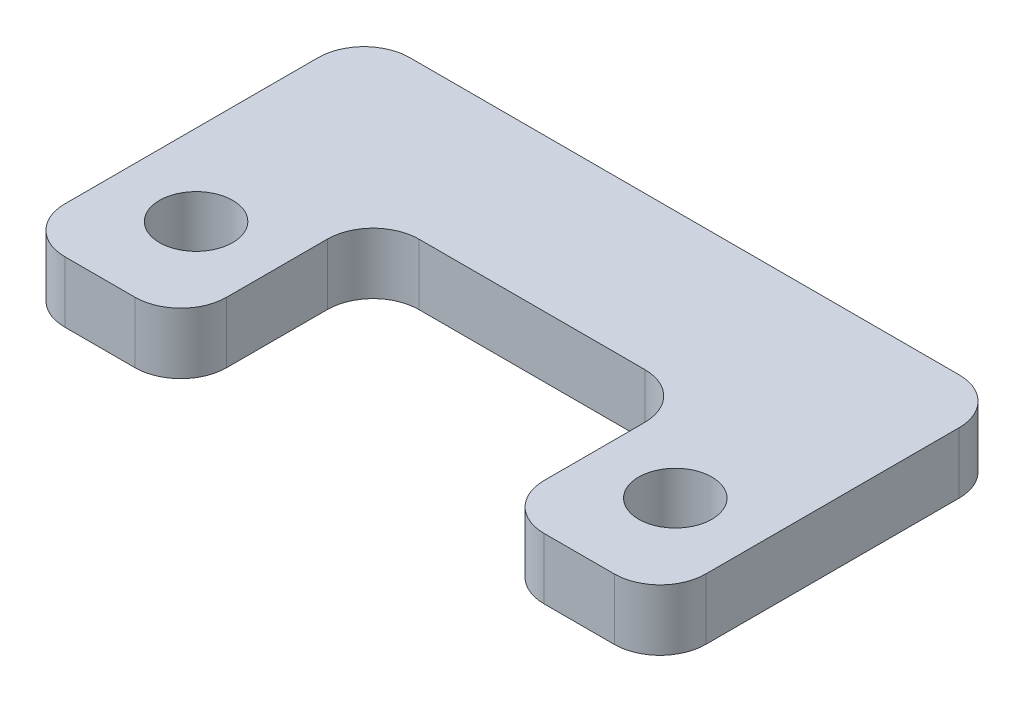
ISO-10303-21;
HEADER;
FILE_DESCRIPTION(('STEP AP214'),'2;1');
FILE_NAME('part.step','',(''),(''),'','','');
FILE_SCHEMA(('AUTOMOTIVE_DESIGN { 1 0 10303 214 1 1 1 1 }'));
ENDSEC;
DATA;
#1=APPLICATION_CONTEXT('core data for automotive mechanical design processes');
#2=APPLICATION_PROTOCOL_DEFINITION('international standard','automotive_design',2000,#1);
#3=PRODUCT_CONTEXT('',#1,'mechanical');
#4=PRODUCT('Part','Part','',(#3));
#5=PRODUCT_RELATED_PRODUCT_CATEGORY('part','',(#4));
#6=PRODUCT_DEFINITION_FORMATION('','',#4);
#7=PRODUCT_DEFINITION_CONTEXT('part definition',#1,'design');
#8=PRODUCT_DEFINITION('design','',#6,#7);
#9=PRODUCT_DEFINITION_SHAPE('','',#8);
#10=(LENGTH_UNIT() NAMED_UNIT(*) SI_UNIT(.MILLI.,.METRE.));
#11=(NAMED_UNIT(*) PLANE_ANGLE_UNIT() SI_UNIT($,.RADIAN.));
#12=(NAMED_UNIT(*) SI_UNIT($,.STERADIAN.) SOLID_ANGLE_UNIT());
#13=UNCERTAINTY_MEASURE_WITH_UNIT(LENGTH_MEASURE(1.E-05),#10,'distance_accuracy_value','');
#14=(GEOMETRIC_REPRESENTATION_CONTEXT(3) GLOBAL_UNCERTAINTY_ASSIGNED_CONTEXT((#13)) GLOBAL_UNIT_ASSIGNED_CONTEXT((#10,
#11,#12)) REPRESENTATION_CONTEXT('',''));
#15=CARTESIAN_POINT('',(0.,0.,0.));
#16=DIRECTION('',(0.,0.,1.));
#17=DIRECTION('',(1.,0.,0.));
#18=AXIS2_PLACEMENT_3D('',#15,#16,#17);
#19=CARTESIAN_POINT('',(10.5,2.,-2.5));
#20=DIRECTION('',(-1.,0.,0.));
#21=DIRECTION('',(0.,0.,1.));
#22=AXIS2_PLACEMENT_3D('',#19,#20,#21);
#23=PLANE('',#22);
#24=DIRECTION('',(0.,0.,-1.));
#25=VECTOR('',#24,1.);
#26=CARTESIAN_POINT('',(10.5,0.,-2.5));
#27=LINE('',#26,#25);
#28=CARTESIAN_POINT('',(10.5,0.,7.3));
#29=VERTEX_POINT('',#28);
#30=CARTESIAN_POINT('',(10.5,0.,-1.));
#31=VERTEX_POINT('',#30);
#32=EDGE_CURVE('E190',#29,#31,#27,.T.);
#33=ORIENTED_EDGE('',*,*,#32,.T.);
#34=DIRECTION('',(0.,-1.,0.));
#35=VECTOR('',#34,1.);
#36=CARTESIAN_POINT('',(10.5,2.,-1.));
#37=LINE('',#36,#35);
#38=CARTESIAN_POINT('',(10.5,2.,-1.));
#39=VERTEX_POINT('',#38);
#40=EDGE_CURVE('E165',#31,#39,#37,.F.);
#41=ORIENTED_EDGE('',*,*,#40,.T.);
#42=DIRECTION('',(0.,0.,-1.));
#43=VECTOR('',#42,1.);
#44=CARTESIAN_POINT('',(10.5,2.,2.5));
#45=LINE('',#44,#43);
#46=CARTESIAN_POINT('',(10.5,2.,7.3));
#47=VERTEX_POINT('',#46);
#48=EDGE_CURVE('E219',#47,#39,#45,.T.);
#49=ORIENTED_EDGE('',*,*,#48,.F.);
#50=DIRECTION('',(0.,-1.,0.));
#51=VECTOR('',#50,1.);
#52=CARTESIAN_POINT('',(10.5,2.,7.3));
#53=LINE('',#52,#51);
#54=EDGE_CURVE('E171',#47,#29,#53,.T.);
#55=ORIENTED_EDGE('',*,*,#54,.T.);
#56=EDGE_LOOP('',(#33,#41,#49,#55));
#57=FACE_BOUND('',#56,.T.);
#58=ADVANCED_FACE('F45',(#57),#23,.F.);
#59=CARTESIAN_POINT('',(-10.5,2.,-2.5));
#60=DIRECTION('',(0.,0.,1.));
#61=DIRECTION('',(1.,0.,0.));
#62=AXIS2_PLACEMENT_3D('',#59,#60,#61);
#63=PLANE('',#62);
#64=DIRECTION('',(-1.,0.,0.));
#65=VECTOR('',#64,1.);
#66=CARTESIAN_POINT('',(-10.5,2.,-2.5));
#67=LINE('',#66,#65);
#68=CARTESIAN_POINT('',(8.99999999999999,2.,-2.5));
#69=VERTEX_POINT('',#68);
#70=CARTESIAN_POINT('',(-9.00000000000001,2.,-2.5));
#71=VERTEX_POINT('',#70);
#72=EDGE_CURVE('E181',#69,#71,#67,.T.);
#73=ORIENTED_EDGE('',*,*,#72,.F.);
#74=DIRECTION('',(0.,-1.,0.));
#75=VECTOR('',#74,1.);
#76=CARTESIAN_POINT('',(8.99999999999999,2.,-2.5));
#77=LINE('',#76,#75);
#78=CARTESIAN_POINT('',(8.99999999999999,0.,-2.5));
#79=VERTEX_POINT('',#78);
#80=EDGE_CURVE('E164',#69,#79,#77,.T.);
#81=ORIENTED_EDGE('',*,*,#80,.T.);
#82=DIRECTION('',(-1.,0.,0.));
#83=VECTOR('',#82,1.);
#84=CARTESIAN_POINT('',(-10.5,0.,-2.5));
#85=LINE('',#84,#83);
#86=CARTESIAN_POINT('',(-9.00000000000001,0.,-2.5));
#87=VERTEX_POINT('',#86);
#88=EDGE_CURVE('E178',#79,#87,#85,.T.);
#89=ORIENTED_EDGE('',*,*,#88,.T.);
#90=DIRECTION('',(0.,-1.,0.));
#91=VECTOR('',#90,1.);
#92=CARTESIAN_POINT('',(-9.00000000000001,2.,-2.5));
#93=LINE('',#92,#91);
#94=EDGE_CURVE('E184',#87,#71,#93,.F.);
#95=ORIENTED_EDGE('',*,*,#94,.T.);
#96=EDGE_LOOP('',(#73,#81,#89,#95));
#97=FACE_BOUND('',#96,.T.);
#98=ADVANCED_FACE('F177',(#97),#63,.F.);
#99=CARTESIAN_POINT('',(-10.5,2.,2.5));
#100=DIRECTION('',(1.,0.,0.));
#101=DIRECTION('',(0.,0.,-1.));
#102=AXIS2_PLACEMENT_3D('',#99,#100,#101);
#103=PLANE('',#102);
#104=DIRECTION('',(0.,0.,1.));
#105=VECTOR('',#104,1.);
#106=CARTESIAN_POINT('',(-10.5,0.,2.5));
#107=LINE('',#106,#105);
#108=CARTESIAN_POINT('',(-10.5,0.,-1.));
#109=VERTEX_POINT('',#108);
#110=CARTESIAN_POINT('',(-10.5,0.,7.3));
#111=VERTEX_POINT('',#110);
#112=EDGE_CURVE('E189',#109,#111,#107,.T.);
#113=ORIENTED_EDGE('',*,*,#112,.T.);
#114=DIRECTION('',(0.,-1.,0.));
#115=VECTOR('',#114,1.);
#116=CARTESIAN_POINT('',(-10.5,2.,7.3));
#117=LINE('',#116,#115);
#118=CARTESIAN_POINT('',(-10.5,2.,7.3));
#119=VERTEX_POINT('',#118);
#120=EDGE_CURVE('E296',#111,#119,#117,.F.);
#121=ORIENTED_EDGE('',*,*,#120,.T.);
#122=DIRECTION('',(0.,0.,1.));
#123=VECTOR('',#122,1.);
#124=CARTESIAN_POINT('',(-10.5,2.,-2.5));
#125=LINE('',#124,#123);
#126=CARTESIAN_POINT('',(-10.5,2.,-1.));
#127=VERTEX_POINT('',#126);
#128=EDGE_CURVE('E339',#127,#119,#125,.T.);
#129=ORIENTED_EDGE('',*,*,#128,.F.);
#130=DIRECTION('',(0.,-1.,0.));
#131=VECTOR('',#130,1.);
#132=CARTESIAN_POINT('',(-10.5,2.,-1.));
#133=LINE('',#132,#131);
#134=EDGE_CURVE('E292',#127,#109,#133,.T.);
#135=ORIENTED_EDGE('',*,*,#134,.T.);
#136=EDGE_LOOP('',(#113,#121,#129,#135));
#137=FACE_BOUND('',#136,.T.);
#138=ADVANCED_FACE('F390',(#137),#103,.F.);
#139=CARTESIAN_POINT('',(-10.5,2.,8.8));
#140=DIRECTION('',(0.,0.,-1.));
#141=DIRECTION('',(-1.,0.,0.));
#142=AXIS2_PLACEMENT_3D('',#139,#140,#141);
#143=PLANE('',#142);
#144=DIRECTION('',(1.,0.,0.));
#145=VECTOR('',#144,1.);
#146=CARTESIAN_POINT('',(-10.5,0.,8.8));
#147=LINE('',#146,#145);
#148=CARTESIAN_POINT('',(-9.00000000000001,0.,8.8));
#149=VERTEX_POINT('',#148);
#150=CARTESIAN_POINT('',(-6.70000000000001,0.,8.8));
#151=VERTEX_POINT('',#150);
#152=EDGE_CURVE('E195',#149,#151,#147,.T.);
#153=ORIENTED_EDGE('',*,*,#152,.T.);
#154=DIRECTION('',(0.,-1.,0.));
#155=VECTOR('',#154,1.);
#156=CARTESIAN_POINT('',(-6.70000000000001,2.,8.8));
#157=LINE('',#156,#155);
#158=CARTESIAN_POINT('',(-6.70000000000001,2.,8.8));
#159=VERTEX_POINT('',#158);
#160=EDGE_CURVE('E289',#151,#159,#157,.F.);
#161=ORIENTED_EDGE('',*,*,#160,.T.);
#162=DIRECTION('',(1.,0.,0.));
#163=VECTOR('',#162,1.);
#164=CARTESIAN_POINT('',(-10.5,2.,8.8));
#165=LINE('',#164,#163);
#166=CARTESIAN_POINT('',(-9.00000000000001,2.,8.8));
#167=VERTEX_POINT('',#166);
#168=EDGE_CURVE('E335',#167,#159,#165,.T.);
#169=ORIENTED_EDGE('',*,*,#168,.F.);
#170=DIRECTION('',(0.,-1.,0.));
#171=VECTOR('',#170,1.);
#172=CARTESIAN_POINT('',(-9.00000000000001,2.,8.8));
#173=LINE('',#172,#171);
#174=EDGE_CURVE('E285',#167,#149,#173,.T.);
#175=ORIENTED_EDGE('',*,*,#174,.T.);
#176=EDGE_LOOP('',(#153,#161,#169,#175));
#177=FACE_BOUND('',#176,.T.);
#178=ADVANCED_FACE('F427',(#177),#143,.F.);
#179=CARTESIAN_POINT('',(-5.20000000000001,2.,2.5));
#180=DIRECTION('',(-1.,0.,0.));
#181=DIRECTION('',(0.,0.,1.));
#182=AXIS2_PLACEMENT_3D('',#179,#180,#181);
#183=PLANE('',#182);
#184=DIRECTION('',(0.,0.,-1.));
#185=VECTOR('',#184,1.);
#186=CARTESIAN_POINT('',(-5.20000000000001,0.,2.5));
#187=LINE('',#186,#185);
#188=CARTESIAN_POINT('',(-5.20000000000001,0.,7.3));
#189=VERTEX_POINT('',#188);
#190=CARTESIAN_POINT('',(-5.20000000000001,0.,4.));
#191=VERTEX_POINT('',#190);
#192=EDGE_CURVE('E204',#189,#191,#187,.T.);
#193=ORIENTED_EDGE('',*,*,#192,.T.);
#194=DIRECTION('',(0.,-1.,0.));
#195=VECTOR('',#194,1.);
#196=CARTESIAN_POINT('',(-5.20000000000001,2.,4.));
#197=LINE('',#196,#195);
#198=CARTESIAN_POINT('',(-5.20000000000001,2.,4.));
#199=VERTEX_POINT('',#198);
#200=EDGE_CURVE('E282',#191,#199,#197,.F.);
#201=ORIENTED_EDGE('',*,*,#200,.T.);
#202=DIRECTION('',(0.,0.,-1.));
#203=VECTOR('',#202,1.);
#204=CARTESIAN_POINT('',(-5.20000000000001,2.,2.5));
#205=LINE('',#204,#203);
#206=CARTESIAN_POINT('',(-5.20000000000001,2.,7.3));
#207=VERTEX_POINT('',#206);
#208=EDGE_CURVE('E329',#207,#199,#205,.T.);
#209=ORIENTED_EDGE('',*,*,#208,.F.);
#210=DIRECTION('',(0.,-1.,0.));
#211=VECTOR('',#210,1.);
#212=CARTESIAN_POINT('',(-5.20000000000001,2.,7.3));
#213=LINE('',#212,#211);
#214=EDGE_CURVE('E278',#207,#189,#213,.T.);
#215=ORIENTED_EDGE('',*,*,#214,.T.);
#216=EDGE_LOOP('',(#193,#201,#209,#215));
#217=FACE_BOUND('',#216,.T.);
#218=ADVANCED_FACE('F434',(#217),#183,.F.);
#219=CARTESIAN_POINT('',(-5.20000000000001,2.,2.5));
#220=DIRECTION('',(0.,0.,-1.));
#221=DIRECTION('',(-1.,0.,0.));
#222=AXIS2_PLACEMENT_3D('',#219,#220,#221);
#223=PLANE('',#222);
#224=DIRECTION('',(1.,0.,0.));
#225=VECTOR('',#224,1.);
#226=CARTESIAN_POINT('',(-5.20000000000001,2.,2.5));
#227=LINE('',#226,#225);
#228=CARTESIAN_POINT('',(-3.70000000000001,2.,2.5));
#229=VERTEX_POINT('',#228);
#230=CARTESIAN_POINT('',(3.69999999999999,2.,2.5));
#231=VERTEX_POINT('',#230);
#232=EDGE_CURVE('E321',#229,#231,#227,.T.);
#233=ORIENTED_EDGE('',*,*,#232,.F.);
#234=DIRECTION('',(0.,-1.,0.));
#235=VECTOR('',#234,1.);
#236=CARTESIAN_POINT('',(-3.70000000000001,0.,2.5));
#237=LINE('',#236,#235);
#238=CARTESIAN_POINT('',(-3.70000000000001,0.,2.5));
#239=VERTEX_POINT('',#238);
#240=EDGE_CURVE('E274',#229,#239,#237,.T.);
#241=ORIENTED_EDGE('',*,*,#240,.T.);
#242=DIRECTION('',(1.,0.,0.));
#243=VECTOR('',#242,1.);
#244=CARTESIAN_POINT('',(-5.20000000000001,0.,2.5));
#245=LINE('',#244,#243);
#246=CARTESIAN_POINT('',(3.69999999999999,0.,2.5));
#247=VERTEX_POINT('',#246);
#248=EDGE_CURVE('E208',#239,#247,#245,.T.);
#249=ORIENTED_EDGE('',*,*,#248,.T.);
#250=DIRECTION('',(0.,-1.,0.));
#251=VECTOR('',#250,1.);
#252=CARTESIAN_POINT('',(3.69999999999999,2.,2.5));
#253=LINE('',#252,#251);
#254=EDGE_CURVE('E271',#247,#231,#253,.F.);
#255=ORIENTED_EDGE('',*,*,#254,.T.);
#256=EDGE_LOOP('',(#233,#241,#249,#255));
#257=FACE_BOUND('',#256,.T.);
#258=ADVANCED_FACE('F312',(#257),#223,.F.);
#259=CARTESIAN_POINT('',(5.19999999999999,2.,2.5));
#260=DIRECTION('',(1.,0.,0.));
#261=DIRECTION('',(0.,0.,-1.));
#262=AXIS2_PLACEMENT_3D('',#259,#260,#261);
#263=PLANE('',#262);
#264=DIRECTION('',(0.,0.,1.));
#265=VECTOR('',#264,1.);
#266=CARTESIAN_POINT('',(5.19999999999999,0.,2.5));
#267=LINE('',#266,#265);
#268=CARTESIAN_POINT('',(5.19999999999999,0.,4.));
#269=VERTEX_POINT('',#268);
#270=CARTESIAN_POINT('',(5.19999999999999,0.,7.3));
#271=VERTEX_POINT('',#270);
#272=EDGE_CURVE('E212',#269,#271,#267,.T.);
#273=ORIENTED_EDGE('',*,*,#272,.T.);
#274=DIRECTION('',(0.,-1.,0.));
#275=VECTOR('',#274,1.);
#276=CARTESIAN_POINT('',(5.19999999999999,2.,7.3));
#277=LINE('',#276,#275);
#278=CARTESIAN_POINT('',(5.19999999999999,2.,7.3));
#279=VERTEX_POINT('',#278);
#280=EDGE_CURVE('E268',#271,#279,#277,.F.);
#281=ORIENTED_EDGE('',*,*,#280,.T.);
#282=DIRECTION('',(0.,0.,1.));
#283=VECTOR('',#282,1.);
#284=CARTESIAN_POINT('',(5.19999999999999,2.,2.5));
#285=LINE('',#284,#283);
#286=CARTESIAN_POINT('',(5.19999999999999,2.,4.));
#287=VERTEX_POINT('',#286);
#288=EDGE_CURVE('E320',#287,#279,#285,.T.);
#289=ORIENTED_EDGE('',*,*,#288,.F.);
#290=DIRECTION('',(0.,-1.,0.));
#291=VECTOR('',#290,1.);
#292=CARTESIAN_POINT('',(5.19999999999999,0.,4.));
#293=LINE('',#292,#291);
#294=EDGE_CURVE('E264',#287,#269,#293,.T.);
#295=ORIENTED_EDGE('',*,*,#294,.T.);
#296=EDGE_LOOP('',(#273,#281,#289,#295));
#297=FACE_BOUND('',#296,.T.);
#298=ADVANCED_FACE('F323',(#297),#263,.F.);
#299=CARTESIAN_POINT('',(10.5,2.,8.8));
#300=DIRECTION('',(0.,0.,-1.));
#301=DIRECTION('',(-1.,0.,0.));
#302=AXIS2_PLACEMENT_3D('',#299,#300,#301);
#303=PLANE('',#302);
#304=DIRECTION('',(1.,0.,0.));
#305=VECTOR('',#304,1.);
#306=CARTESIAN_POINT('',(10.5,0.,8.8));
#307=LINE('',#306,#305);
#308=CARTESIAN_POINT('',(6.69999999999999,0.,8.8));
#309=VERTEX_POINT('',#308);
#310=CARTESIAN_POINT('',(8.99999999999999,0.,8.8));
#311=VERTEX_POINT('',#310);
#312=EDGE_CURVE('E216',#309,#311,#307,.T.);
#313=ORIENTED_EDGE('',*,*,#312,.T.);
#314=DIRECTION('',(0.,-1.,0.));
#315=VECTOR('',#314,1.);
#316=CARTESIAN_POINT('',(8.99999999999999,2.,8.8));
#317=LINE('',#316,#315);
#318=CARTESIAN_POINT('',(8.99999999999999,2.,8.8));
#319=VERTEX_POINT('',#318);
#320=EDGE_CURVE('E61',#311,#319,#317,.F.);
#321=ORIENTED_EDGE('',*,*,#320,.T.);
#322=DIRECTION('',(1.,0.,0.));
#323=VECTOR('',#322,1.);
#324=CARTESIAN_POINT('',(10.5,2.,8.8));
#325=LINE('',#324,#323);
#326=CARTESIAN_POINT('',(6.69999999999999,2.,8.8));
#327=VERTEX_POINT('',#326);
#328=EDGE_CURVE('E221',#327,#319,#325,.T.);
#329=ORIENTED_EDGE('',*,*,#328,.F.);
#330=DIRECTION('',(0.,-1.,0.));
#331=VECTOR('',#330,1.);
#332=CARTESIAN_POINT('',(6.69999999999999,2.,8.8));
#333=LINE('',#332,#331);
#334=EDGE_CURVE('E258',#327,#309,#333,.T.);
#335=ORIENTED_EDGE('',*,*,#334,.T.);
#336=EDGE_LOOP('',(#313,#321,#329,#335));
#337=FACE_BOUND('',#336,.T.);
#338=ADVANCED_FACE('F367',(#337),#303,.F.);
#339=CARTESIAN_POINT('',(0.,2.,0.));
#340=DIRECTION('',(0.,-1.,0.));
#341=DIRECTION('',(0.,0.,-1.));
#342=AXIS2_PLACEMENT_3D('',#339,#340,#341);
#343=PLANE('',#342);
#344=CARTESIAN_POINT('',(-7.85,2.,5.65));
#345=DIRECTION('',(0.,1.,0.));
#346=DIRECTION('',(0.,0.,1.));
#347=AXIS2_PLACEMENT_3D('',#344,#345,#346);
#348=CIRCLE('',#347,1.2);
#349=CARTESIAN_POINT('',(-7.85,2.,6.85));
#350=VERTEX_POINT('',#349);
#351=EDGE_CURVE('E358',#350,#350,#348,.T.);
#352=ORIENTED_EDGE('',*,*,#351,.F.);
#353=EDGE_LOOP('',(#352));
#354=FACE_BOUND('',#353,.T.);
#355=CARTESIAN_POINT('',(7.85,2.,5.65));
#356=DIRECTION('',(0.,1.,0.));
#357=DIRECTION('',(0.,0.,1.));
#358=AXIS2_PLACEMENT_3D('',#355,#356,#357);
#359=CIRCLE('',#358,1.2);
#360=CARTESIAN_POINT('',(7.85,2.,6.85));
#361=VERTEX_POINT('',#360);
#362=EDGE_CURVE('E350',#361,#361,#359,.T.);
#363=ORIENTED_EDGE('',*,*,#362,.F.);
#364=EDGE_LOOP('',(#363));
#365=FACE_BOUND('',#364,.T.);
#366=ORIENTED_EDGE('',*,*,#48,.T.);
#367=CARTESIAN_POINT('',(8.99999999999999,2.,-1.));
#368=DIRECTION('',(0.,-1.,0.));
#369=DIRECTION('',(0.,0.,-1.));
#370=AXIS2_PLACEMENT_3D('',#367,#368,#369);
#371=CIRCLE('',#370,1.5);
#372=EDGE_CURVE('E255',#39,#69,#371,.F.);
#373=ORIENTED_EDGE('',*,*,#372,.T.);
#374=ORIENTED_EDGE('',*,*,#72,.T.);
#375=CARTESIAN_POINT('',(-9.00000000000001,2.,-1.));
#376=DIRECTION('',(0.,-1.,0.));
#377=DIRECTION('',(0.,0.,-1.));
#378=AXIS2_PLACEMENT_3D('',#375,#376,#377);
#379=CIRCLE('',#378,1.5);
#380=EDGE_CURVE('E241',#71,#127,#379,.F.);
#381=ORIENTED_EDGE('',*,*,#380,.T.);
#382=ORIENTED_EDGE('',*,*,#128,.T.);
#383=CARTESIAN_POINT('',(-9.00000000000001,2.,7.3));
#384=DIRECTION('',(0.,-1.,0.));
#385=DIRECTION('',(0.,0.,-1.));
#386=AXIS2_PLACEMENT_3D('',#383,#384,#385);
#387=CIRCLE('',#386,1.5);
#388=EDGE_CURVE('E244',#119,#167,#387,.F.);
#389=ORIENTED_EDGE('',*,*,#388,.T.);
#390=ORIENTED_EDGE('',*,*,#168,.T.);
#391=CARTESIAN_POINT('',(-6.70000000000001,2.,7.3));
#392=DIRECTION('',(0.,-1.,0.));
#393=DIRECTION('',(0.,0.,-1.));
#394=AXIS2_PLACEMENT_3D('',#391,#392,#393);
#395=CIRCLE('',#394,1.5);
#396=EDGE_CURVE('E247',#159,#207,#395,.F.);
#397=ORIENTED_EDGE('',*,*,#396,.T.);
#398=ORIENTED_EDGE('',*,*,#208,.T.);
#399=CARTESIAN_POINT('',(-3.70000000000001,2.,4.));
#400=DIRECTION('',(0.,-1.,0.));
#401=DIRECTION('',(0.,0.,-1.));
#402=AXIS2_PLACEMENT_3D('',#399,#400,#401);
#403=CIRCLE('',#402,1.5);
#404=EDGE_CURVE('E302',#199,#229,#403,.T.);
#405=ORIENTED_EDGE('',*,*,#404,.T.);
#406=ORIENTED_EDGE('',*,*,#232,.T.);
#407=CARTESIAN_POINT('',(3.69999999999999,2.,4.));
#408=DIRECTION('',(0.,-1.,0.));
#409=DIRECTION('',(0.,0.,-1.));
#410=AXIS2_PLACEMENT_3D('',#407,#408,#409);
#411=CIRCLE('',#410,1.5);
#412=EDGE_CURVE('E11',#231,#287,#411,.T.);
#413=ORIENTED_EDGE('',*,*,#412,.T.);
#414=ORIENTED_EDGE('',*,*,#288,.T.);
#415=CARTESIAN_POINT('',(6.69999999999999,2.,7.3));
#416=DIRECTION('',(0.,-1.,0.));
#417=DIRECTION('',(0.,0.,-1.));
#418=AXIS2_PLACEMENT_3D('',#415,#416,#417);
#419=CIRCLE('',#418,1.5);
#420=EDGE_CURVE('E68',#279,#327,#419,.F.);
#421=ORIENTED_EDGE('',*,*,#420,.T.);
#422=ORIENTED_EDGE('',*,*,#328,.T.);
#423=CARTESIAN_POINT('',(8.99999999999999,2.,7.3));
#424=DIRECTION('',(0.,-1.,0.));
#425=DIRECTION('',(0.,0.,-1.));
#426=AXIS2_PLACEMENT_3D('',#423,#424,#425);
#427=CIRCLE('',#426,1.5);
#428=EDGE_CURVE('E252',#319,#47,#427,.F.);
#429=ORIENTED_EDGE('',*,*,#428,.T.);
#430=EDGE_LOOP('',(#366,#373,#374,#381,#382,#389,#390,#397,#398,#405,#406,#413,#414,#421,#422,#429));
#431=FACE_BOUND('',#430,.T.);
#432=ADVANCED_FACE('F319',(#354,#365,#431),#343,.F.);
#433=CARTESIAN_POINT('',(0.,0.,0.));
#434=DIRECTION('',(0.,-1.,0.));
#435=DIRECTION('',(0.,0.,-1.));
#436=AXIS2_PLACEMENT_3D('',#433,#434,#435);
#437=PLANE('',#436);
#438=CARTESIAN_POINT('',(-7.85,0.,5.65));
#439=DIRECTION('',(0.,1.,0.));
#440=DIRECTION('',(0.,0.,1.));
#441=AXIS2_PLACEMENT_3D('',#438,#439,#440);
#442=CIRCLE('',#441,1.2);
#443=CARTESIAN_POINT('',(-7.85,0.,6.85));
#444=VERTEX_POINT('',#443);
#445=EDGE_CURVE('E354',#444,#444,#442,.T.);
#446=ORIENTED_EDGE('',*,*,#445,.T.);
#447=EDGE_LOOP('',(#446));
#448=FACE_BOUND('',#447,.T.);
#449=CARTESIAN_POINT('',(7.85,0.,5.65));
#450=DIRECTION('',(0.,1.,0.));
#451=DIRECTION('',(0.,0.,1.));
#452=AXIS2_PLACEMENT_3D('',#449,#450,#451);
#453=CIRCLE('',#452,1.2);
#454=CARTESIAN_POINT('',(7.85,0.,6.85));
#455=VERTEX_POINT('',#454);
#456=EDGE_CURVE('E197',#455,#455,#453,.T.);
#457=ORIENTED_EDGE('',*,*,#456,.T.);
#458=EDGE_LOOP('',(#457));
#459=FACE_BOUND('',#458,.T.);
#460=ORIENTED_EDGE('',*,*,#88,.F.);
#461=CARTESIAN_POINT('',(8.99999999999999,0.,-1.));
#462=DIRECTION('',(0.,-1.,0.));
#463=DIRECTION('',(0.,0.,-1.));
#464=AXIS2_PLACEMENT_3D('',#461,#462,#463);
#465=CIRCLE('',#464,1.5);
#466=EDGE_CURVE('E160',#79,#31,#465,.T.);
#467=ORIENTED_EDGE('',*,*,#466,.T.);
#468=ORIENTED_EDGE('',*,*,#32,.F.);
#469=CARTESIAN_POINT('',(8.99999999999999,0.,7.3));
#470=DIRECTION('',(0.,-1.,0.));
#471=DIRECTION('',(0.,0.,-1.));
#472=AXIS2_PLACEMENT_3D('',#469,#470,#471);
#473=CIRCLE('',#472,1.5);
#474=EDGE_CURVE('E172',#29,#311,#473,.T.);
#475=ORIENTED_EDGE('',*,*,#474,.T.);
#476=ORIENTED_EDGE('',*,*,#312,.F.);
#477=CARTESIAN_POINT('',(6.69999999999999,0.,7.3));
#478=DIRECTION('',(0.,-1.,0.));
#479=DIRECTION('',(0.,0.,-1.));
#480=AXIS2_PLACEMENT_3D('',#477,#478,#479);
#481=CIRCLE('',#480,1.5);
#482=EDGE_CURVE('E231',#309,#271,#481,.T.);
#483=ORIENTED_EDGE('',*,*,#482,.T.);
#484=ORIENTED_EDGE('',*,*,#272,.F.);
#485=CARTESIAN_POINT('',(3.69999999999999,0.,4.));
#486=DIRECTION('',(0.,-1.,0.));
#487=DIRECTION('',(0.,0.,-1.));
#488=AXIS2_PLACEMENT_3D('',#485,#486,#487);
#489=CIRCLE('',#488,1.5);
#490=EDGE_CURVE('E54',#269,#247,#489,.F.);
#491=ORIENTED_EDGE('',*,*,#490,.T.);
#492=ORIENTED_EDGE('',*,*,#248,.F.);
#493=CARTESIAN_POINT('',(-3.70000000000001,0.,4.));
#494=DIRECTION('',(0.,-1.,0.));
#495=DIRECTION('',(0.,0.,-1.));
#496=AXIS2_PLACEMENT_3D('',#493,#494,#495);
#497=CIRCLE('',#496,1.5);
#498=EDGE_CURVE('E299',#239,#191,#497,.F.);
#499=ORIENTED_EDGE('',*,*,#498,.T.);
#500=ORIENTED_EDGE('',*,*,#192,.F.);
#501=CARTESIAN_POINT('',(-6.70000000000001,0.,7.3));
#502=DIRECTION('',(0.,-1.,0.));
#503=DIRECTION('',(0.,0.,-1.));
#504=AXIS2_PLACEMENT_3D('',#501,#502,#503);
#505=CIRCLE('',#504,1.5);
#506=EDGE_CURVE('E228',#189,#151,#505,.T.);
#507=ORIENTED_EDGE('',*,*,#506,.T.);
#508=ORIENTED_EDGE('',*,*,#152,.F.);
#509=CARTESIAN_POINT('',(-9.00000000000001,0.,7.3));
#510=DIRECTION('',(0.,-1.,0.));
#511=DIRECTION('',(0.,0.,-1.));
#512=AXIS2_PLACEMENT_3D('',#509,#510,#511);
#513=CIRCLE('',#512,1.5);
#514=EDGE_CURVE('E225',#149,#111,#513,.T.);
#515=ORIENTED_EDGE('',*,*,#514,.T.);
#516=ORIENTED_EDGE('',*,*,#112,.F.);
#517=CARTESIAN_POINT('',(-9.00000000000001,0.,-1.));
#518=DIRECTION('',(0.,-1.,0.));
#519=DIRECTION('',(0.,0.,-1.));
#520=AXIS2_PLACEMENT_3D('',#517,#518,#519);
#521=CIRCLE('',#520,1.5);
#522=EDGE_CURVE('E183',#109,#87,#521,.T.);
#523=ORIENTED_EDGE('',*,*,#522,.T.);
#524=EDGE_LOOP('',(#460,#467,#468,#475,#476,#483,#484,#491,#492,#499,#500,#507,#508,#515,#516,#523));
#525=FACE_BOUND('',#524,.T.);
#526=ADVANCED_FACE('F186',(#448,#459,#525),#437,.T.);
#527=CARTESIAN_POINT('',(7.85,2.,5.65));
#528=DIRECTION('',(0.,1.,0.));
#529=DIRECTION('',(0.,0.,1.));
#530=AXIS2_PLACEMENT_3D('',#527,#528,#529);
#531=CYLINDRICAL_SURFACE('',#530,1.2);
#532=ORIENTED_EDGE('',*,*,#456,.F.);
#533=EDGE_LOOP('',(#532));
#534=FACE_BOUND('',#533,.T.);
#535=ORIENTED_EDGE('',*,*,#362,.T.);
#536=EDGE_LOOP('',(#535));
#537=FACE_BOUND('',#536,.T.);
#538=ADVANCED_FACE('F371',(#534,#537),#531,.F.);
#539=CARTESIAN_POINT('',(-7.85,2.,5.65));
#540=DIRECTION('',(0.,1.,0.));
#541=DIRECTION('',(0.,0.,1.));
#542=AXIS2_PLACEMENT_3D('',#539,#540,#541);
#543=CYLINDRICAL_SURFACE('',#542,1.2);
#544=ORIENTED_EDGE('',*,*,#445,.F.);
#545=EDGE_LOOP('',(#544));
#546=FACE_BOUND('',#545,.T.);
#547=ORIENTED_EDGE('',*,*,#351,.T.);
#548=EDGE_LOOP('',(#547));
#549=FACE_BOUND('',#548,.T.);
#550=ADVANCED_FACE('F363',(#546,#549),#543,.F.);
#551=CARTESIAN_POINT('',(8.99999999999999,2.,-1.));
#552=DIRECTION('',(0.,-1.,0.));
#553=DIRECTION('',(0.,0.,-1.));
#554=AXIS2_PLACEMENT_3D('',#551,#552,#553);
#555=CYLINDRICAL_SURFACE('',#554,1.5);
#556=ORIENTED_EDGE('',*,*,#372,.F.);
#557=ORIENTED_EDGE('',*,*,#40,.F.);
#558=ORIENTED_EDGE('',*,*,#466,.F.);
#559=ORIENTED_EDGE('',*,*,#80,.F.);
#560=EDGE_LOOP('',(#556,#557,#558,#559));
#561=FACE_BOUND('',#560,.T.);
#562=ADVANCED_FACE('F163',(#561),#555,.T.);
#563=CARTESIAN_POINT('',(8.99999999999999,2.,7.3));
#564=DIRECTION('',(0.,-1.,0.));
#565=DIRECTION('',(0.,0.,-1.));
#566=AXIS2_PLACEMENT_3D('',#563,#564,#565);
#567=CYLINDRICAL_SURFACE('',#566,1.5);
#568=ORIENTED_EDGE('',*,*,#428,.F.);
#569=ORIENTED_EDGE('',*,*,#320,.F.);
#570=ORIENTED_EDGE('',*,*,#474,.F.);
#571=ORIENTED_EDGE('',*,*,#54,.F.);
#572=EDGE_LOOP('',(#568,#569,#570,#571));
#573=FACE_BOUND('',#572,.T.);
#574=ADVANCED_FACE('F396',(#573),#567,.T.);
#575=CARTESIAN_POINT('',(6.69999999999999,2.,7.3));
#576=DIRECTION('',(0.,-1.,0.));
#577=DIRECTION('',(0.,0.,-1.));
#578=AXIS2_PLACEMENT_3D('',#575,#576,#577);
#579=CYLINDRICAL_SURFACE('',#578,1.5);
#580=ORIENTED_EDGE('',*,*,#420,.F.);
#581=ORIENTED_EDGE('',*,*,#280,.F.);
#582=ORIENTED_EDGE('',*,*,#482,.F.);
#583=ORIENTED_EDGE('',*,*,#334,.F.);
#584=EDGE_LOOP('',(#580,#581,#582,#583));
#585=FACE_BOUND('',#584,.T.);
#586=ADVANCED_FACE('F399',(#585),#579,.T.);
#587=CARTESIAN_POINT('',(-3.70000000000001,2.,4.));
#588=DIRECTION('',(0.,1.,0.));
#589=DIRECTION('',(0.,0.,1.));
#590=AXIS2_PLACEMENT_3D('',#587,#588,#589);
#591=CYLINDRICAL_SURFACE('',#590,1.5);
#592=ORIENTED_EDGE('',*,*,#404,.F.);
#593=ORIENTED_EDGE('',*,*,#200,.F.);
#594=ORIENTED_EDGE('',*,*,#498,.F.);
#595=ORIENTED_EDGE('',*,*,#240,.F.);
#596=EDGE_LOOP('',(#592,#593,#594,#595));
#597=FACE_BOUND('',#596,.T.);
#598=ADVANCED_FACE('F403',(#597),#591,.F.);
#599=CARTESIAN_POINT('',(3.69999999999999,2.,4.));
#600=DIRECTION('',(0.,1.,0.));
#601=DIRECTION('',(0.,0.,1.));
#602=AXIS2_PLACEMENT_3D('',#599,#600,#601);
#603=CYLINDRICAL_SURFACE('',#602,1.5);
#604=ORIENTED_EDGE('',*,*,#412,.F.);
#605=ORIENTED_EDGE('',*,*,#254,.F.);
#606=ORIENTED_EDGE('',*,*,#490,.F.);
#607=ORIENTED_EDGE('',*,*,#294,.F.);
#608=EDGE_LOOP('',(#604,#605,#606,#607));
#609=FACE_BOUND('',#608,.T.);
#610=ADVANCED_FACE('F316',(#609),#603,.F.);
#611=CARTESIAN_POINT('',(-6.70000000000001,2.,7.3));
#612=DIRECTION('',(0.,-1.,0.));
#613=DIRECTION('',(0.,0.,-1.));
#614=AXIS2_PLACEMENT_3D('',#611,#612,#613);
#615=CYLINDRICAL_SURFACE('',#614,1.5);
#616=ORIENTED_EDGE('',*,*,#396,.F.);
#617=ORIENTED_EDGE('',*,*,#160,.F.);
#618=ORIENTED_EDGE('',*,*,#506,.F.);
#619=ORIENTED_EDGE('',*,*,#214,.F.);
#620=EDGE_LOOP('',(#616,#617,#618,#619));
#621=FACE_BOUND('',#620,.T.);
#622=ADVANCED_FACE('F410',(#621),#615,.T.);
#623=CARTESIAN_POINT('',(-9.00000000000001,2.,7.3));
#624=DIRECTION('',(0.,-1.,0.));
#625=DIRECTION('',(0.,0.,-1.));
#626=AXIS2_PLACEMENT_3D('',#623,#624,#625);
#627=CYLINDRICAL_SURFACE('',#626,1.5);
#628=ORIENTED_EDGE('',*,*,#388,.F.);
#629=ORIENTED_EDGE('',*,*,#120,.F.);
#630=ORIENTED_EDGE('',*,*,#514,.F.);
#631=ORIENTED_EDGE('',*,*,#174,.F.);
#632=EDGE_LOOP('',(#628,#629,#630,#631));
#633=FACE_BOUND('',#632,.T.);
#634=ADVANCED_FACE('F412',(#633),#627,.T.);
#635=CARTESIAN_POINT('',(-9.00000000000001,2.,-1.));
#636=DIRECTION('',(0.,-1.,0.));
#637=DIRECTION('',(0.,0.,-1.));
#638=AXIS2_PLACEMENT_3D('',#635,#636,#637);
#639=CYLINDRICAL_SURFACE('',#638,1.5);
#640=ORIENTED_EDGE('',*,*,#380,.F.);
#641=ORIENTED_EDGE('',*,*,#94,.F.);
#642=ORIENTED_EDGE('',*,*,#522,.F.);
#643=ORIENTED_EDGE('',*,*,#134,.F.);
#644=EDGE_LOOP('',(#640,#641,#642,#643));
#645=FACE_BOUND('',#644,.T.);
#646=ADVANCED_FACE('F47',(#645),#639,.T.);
#647=CLOSED_SHELL('',(#58,#98,#138,#178,#218,#258,#298,#338,#432,#526,#538,#550,#562,#574,#586,
#598,#610,#622,#634,#646));
#648=MANIFOLD_SOLID_BREP('B2',#647);
#649=ADVANCED_BREP_SHAPE_REPRESENTATION('',(#18,#648),#14);
#650=SHAPE_DEFINITION_REPRESENTATION(#9,#649);
ENDSEC;
END-ISO-10303-21;
